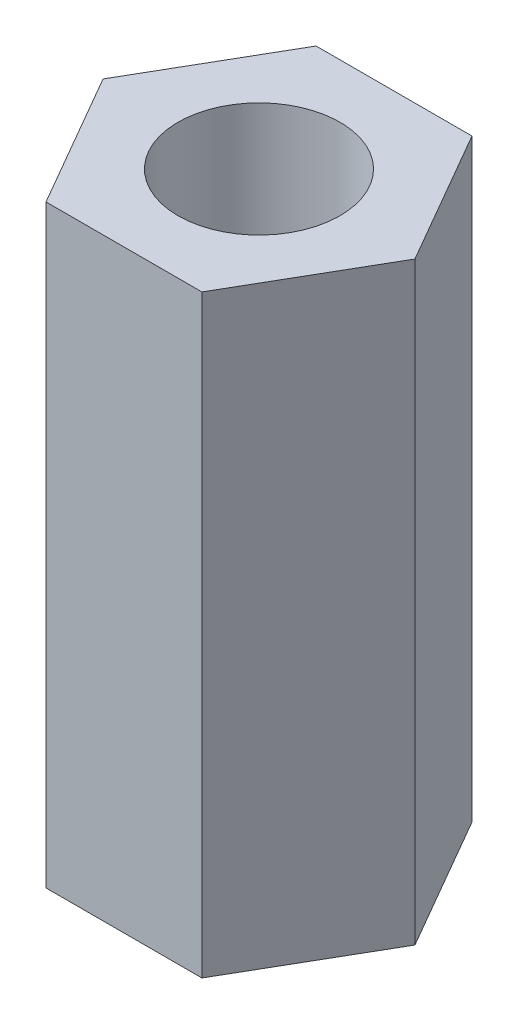
ISO-10303-21;
HEADER;
FILE_DESCRIPTION(('STEP AP214'),'2;1');
FILE_NAME('part.step','',(''),(''),'','','');
FILE_SCHEMA(('AUTOMOTIVE_DESIGN { 1 0 10303 214 1 1 1 1 }'));
ENDSEC;
DATA;
#1=APPLICATION_CONTEXT('core data for automotive mechanical design processes');
#2=APPLICATION_PROTOCOL_DEFINITION('international standard','automotive_design',2000,#1);
#3=PRODUCT_CONTEXT('',#1,'mechanical');
#4=PRODUCT('Part','Part','',(#3));
#5=PRODUCT_RELATED_PRODUCT_CATEGORY('part','',(#4));
#6=PRODUCT_DEFINITION_FORMATION('','',#4);
#7=PRODUCT_DEFINITION_CONTEXT('part definition',#1,'design');
#8=PRODUCT_DEFINITION('design','',#6,#7);
#9=PRODUCT_DEFINITION_SHAPE('','',#8);
#10=(LENGTH_UNIT() NAMED_UNIT(*) SI_UNIT(.MILLI.,.METRE.));
#11=(NAMED_UNIT(*) PLANE_ANGLE_UNIT() SI_UNIT($,.RADIAN.));
#12=(NAMED_UNIT(*) SI_UNIT($,.STERADIAN.) SOLID_ANGLE_UNIT());
#13=UNCERTAINTY_MEASURE_WITH_UNIT(LENGTH_MEASURE(1.E-05),#10,'distance_accuracy_value','');
#14=(GEOMETRIC_REPRESENTATION_CONTEXT(3) GLOBAL_UNCERTAINTY_ASSIGNED_CONTEXT((#13)) GLOBAL_UNIT_ASSIGNED_CONTEXT((#10,
#11,#12)) REPRESENTATION_CONTEXT('',''));
#15=CARTESIAN_POINT('',(0.,0.,0.));
#16=DIRECTION('',(0.,0.,1.));
#17=DIRECTION('',(1.,0.,0.));
#18=AXIS2_PLACEMENT_3D('',#15,#16,#17);
#19=CARTESIAN_POINT('',(-1.44337567297405,6.,2.5));
#20=DIRECTION('',(0.,0.,-1.));
#21=DIRECTION('',(-1.,0.,0.));
#22=AXIS2_PLACEMENT_3D('',#19,#20,#21);
#23=PLANE('',#22);
#24=DIRECTION('',(1.,0.,0.));
#25=VECTOR('',#24,1.);
#26=CARTESIAN_POINT('',(-1.44337567297405,5.,2.5));
#27=LINE('',#26,#25);
#28=CARTESIAN_POINT('',(-1.44337567297405,5.,2.5));
#29=VERTEX_POINT('',#28);
#30=CARTESIAN_POINT('',(1.44337567297408,5.,2.5));
#31=VERTEX_POINT('',#30);
#32=EDGE_CURVE('E86',#29,#31,#27,.T.);
#33=ORIENTED_EDGE('',*,*,#32,.F.);
#34=DIRECTION('',(0.,-1.,0.));
#35=VECTOR('',#34,1.);
#36=CARTESIAN_POINT('',(-1.44337567297405,6.,2.5));
#37=LINE('',#36,#35);
#38=CARTESIAN_POINT('',(-1.44337567297405,-6.,2.5));
#39=VERTEX_POINT('',#38);
#40=EDGE_CURVE('E56',#29,#39,#37,.T.);
#41=ORIENTED_EDGE('',*,*,#40,.T.);
#42=DIRECTION('',(1.,0.,0.));
#43=VECTOR('',#42,1.);
#44=CARTESIAN_POINT('',(-1.44337567297405,-6.,2.5));
#45=LINE('',#44,#43);
#46=CARTESIAN_POINT('',(1.44337567297408,-6.,2.5));
#47=VERTEX_POINT('',#46);
#48=EDGE_CURVE('E125',#39,#47,#45,.T.);
#49=ORIENTED_EDGE('',*,*,#48,.T.);
#50=DIRECTION('',(0.,-1.,0.));
#51=VECTOR('',#50,1.);
#52=CARTESIAN_POINT('',(1.44337567297408,6.,2.5));
#53=LINE('',#52,#51);
#54=EDGE_CURVE('E11',#31,#47,#53,.T.);
#55=ORIENTED_EDGE('',*,*,#54,.F.);
#56=EDGE_LOOP('',(#33,#41,#49,#55));
#57=FACE_BOUND('',#56,.T.);
#58=ADVANCED_FACE('F33',(#57),#23,.F.);
#59=CARTESIAN_POINT('',(1.44337567297408,6.,2.5));
#60=DIRECTION('',(-0.866025403784438,0.,-0.500000000000001));
#61=DIRECTION('',(-0.500000000000001,0.,0.866025403784438));
#62=AXIS2_PLACEMENT_3D('',#59,#60,#61);
#63=PLANE('',#62);
#64=DIRECTION('',(0.500000000000001,0.,-0.866025403784438));
#65=VECTOR('',#64,1.);
#66=CARTESIAN_POINT('',(1.44337567297408,5.,2.5));
#67=LINE('',#66,#65);
#68=CARTESIAN_POINT('',(2.88675134594815,5.,0.));
#69=VERTEX_POINT('',#68);
#70=EDGE_CURVE('E92',#31,#69,#67,.T.);
#71=ORIENTED_EDGE('',*,*,#70,.F.);
#72=ORIENTED_EDGE('',*,*,#54,.T.);
#73=DIRECTION('',(0.500000000000001,0.,-0.866025403784438));
#74=VECTOR('',#73,1.);
#75=CARTESIAN_POINT('',(1.44337567297408,-6.,2.5));
#76=LINE('',#75,#74);
#77=CARTESIAN_POINT('',(2.88675134594815,-6.,0.));
#78=VERTEX_POINT('',#77);
#79=EDGE_CURVE('E122',#47,#78,#76,.T.);
#80=ORIENTED_EDGE('',*,*,#79,.T.);
#81=DIRECTION('',(0.,-1.,0.));
#82=VECTOR('',#81,1.);
#83=CARTESIAN_POINT('',(2.88675134594815,6.,0.));
#84=LINE('',#83,#82);
#85=EDGE_CURVE('E41',#69,#78,#84,.T.);
#86=ORIENTED_EDGE('',*,*,#85,.F.);
#87=EDGE_LOOP('',(#71,#72,#80,#86));
#88=FACE_BOUND('',#87,.T.);
#89=ADVANCED_FACE('F123',(#88),#63,.F.);
#90=CARTESIAN_POINT('',(2.88675134594815,6.,0.));
#91=DIRECTION('',(-0.866025403784438,0.,0.500000000000001));
#92=DIRECTION('',(0.500000000000001,0.,0.866025403784438));
#93=AXIS2_PLACEMENT_3D('',#90,#91,#92);
#94=PLANE('',#93);
#95=DIRECTION('',(-0.500000000000001,0.,-0.866025403784438));
#96=VECTOR('',#95,1.);
#97=CARTESIAN_POINT('',(2.88675134594815,5.,0.));
#98=LINE('',#97,#96);
#99=CARTESIAN_POINT('',(1.44337567297408,5.,-2.50000000000001));
#100=VERTEX_POINT('',#99);
#101=EDGE_CURVE('E119',#69,#100,#98,.T.);
#102=ORIENTED_EDGE('',*,*,#101,.F.);
#103=ORIENTED_EDGE('',*,*,#85,.T.);
#104=DIRECTION('',(-0.500000000000001,0.,-0.866025403784438));
#105=VECTOR('',#104,1.);
#106=CARTESIAN_POINT('',(2.88675134594815,-6.,0.));
#107=LINE('',#106,#105);
#108=CARTESIAN_POINT('',(1.44337567297408,-6.,-2.50000000000001));
#109=VERTEX_POINT('',#108);
#110=EDGE_CURVE('E117',#78,#109,#107,.T.);
#111=ORIENTED_EDGE('',*,*,#110,.T.);
#112=DIRECTION('',(0.,-1.,0.));
#113=VECTOR('',#112,1.);
#114=CARTESIAN_POINT('',(1.44337567297408,6.,-2.50000000000001));
#115=LINE('',#114,#113);
#116=EDGE_CURVE('E107',#100,#109,#115,.T.);
#117=ORIENTED_EDGE('',*,*,#116,.F.);
#118=EDGE_LOOP('',(#102,#103,#111,#117));
#119=FACE_BOUND('',#118,.T.);
#120=ADVANCED_FACE('F114',(#119),#94,.F.);
#121=CARTESIAN_POINT('',(1.44337567297408,6.,-2.50000000000001));
#122=DIRECTION('',(0.,0.,1.));
#123=DIRECTION('',(1.,0.,0.));
#124=AXIS2_PLACEMENT_3D('',#121,#122,#123);
#125=PLANE('',#124);
#126=DIRECTION('',(-1.,0.,0.));
#127=VECTOR('',#126,1.);
#128=CARTESIAN_POINT('',(1.44337567297408,5.,-2.50000000000001));
#129=LINE('',#128,#127);
#130=CARTESIAN_POINT('',(-1.44337567297405,5.,-2.50000000000001));
#131=VERTEX_POINT('',#130);
#132=EDGE_CURVE('E144',#100,#131,#129,.T.);
#133=ORIENTED_EDGE('',*,*,#132,.F.);
#134=ORIENTED_EDGE('',*,*,#116,.T.);
#135=DIRECTION('',(-1.,0.,0.));
#136=VECTOR('',#135,1.);
#137=CARTESIAN_POINT('',(1.44337567297408,-6.,-2.50000000000001));
#138=LINE('',#137,#136);
#139=CARTESIAN_POINT('',(-1.44337567297405,-6.,-2.50000000000001));
#140=VERTEX_POINT('',#139);
#141=EDGE_CURVE('E131',#109,#140,#138,.T.);
#142=ORIENTED_EDGE('',*,*,#141,.T.);
#143=DIRECTION('',(0.,-1.,0.));
#144=VECTOR('',#143,1.);
#145=CARTESIAN_POINT('',(-1.44337567297405,6.,-2.50000000000001));
#146=LINE('',#145,#144);
#147=EDGE_CURVE('E100',#131,#140,#146,.T.);
#148=ORIENTED_EDGE('',*,*,#147,.F.);
#149=EDGE_LOOP('',(#133,#134,#142,#148));
#150=FACE_BOUND('',#149,.T.);
#151=ADVANCED_FACE('F149',(#150),#125,.F.);
#152=CARTESIAN_POINT('',(-1.44337567297405,6.,-2.50000000000001));
#153=DIRECTION('',(0.866025403784439,0.,0.5));
#154=DIRECTION('',(0.5,0.,-0.866025403784439));
#155=AXIS2_PLACEMENT_3D('',#152,#153,#154);
#156=PLANE('',#155);
#157=DIRECTION('',(-0.5,0.,0.866025403784438));
#158=VECTOR('',#157,1.);
#159=CARTESIAN_POINT('',(-1.44337567297405,5.,-2.50000000000001));
#160=LINE('',#159,#158);
#161=CARTESIAN_POINT('',(-2.88675134594812,5.,0.));
#162=VERTEX_POINT('',#161);
#163=EDGE_CURVE('E48',#131,#162,#160,.T.);
#164=ORIENTED_EDGE('',*,*,#163,.F.);
#165=ORIENTED_EDGE('',*,*,#147,.T.);
#166=DIRECTION('',(-0.5,0.,0.866025403784438));
#167=VECTOR('',#166,1.);
#168=CARTESIAN_POINT('',(-1.44337567297405,-6.,-2.50000000000001));
#169=LINE('',#168,#167);
#170=CARTESIAN_POINT('',(-2.88675134594812,-6.,0.));
#171=VERTEX_POINT('',#170);
#172=EDGE_CURVE('E102',#140,#171,#169,.T.);
#173=ORIENTED_EDGE('',*,*,#172,.T.);
#174=DIRECTION('',(0.,-1.,0.));
#175=VECTOR('',#174,1.);
#176=CARTESIAN_POINT('',(-2.88675134594812,6.,0.));
#177=LINE('',#176,#175);
#178=EDGE_CURVE('E98',#162,#171,#177,.T.);
#179=ORIENTED_EDGE('',*,*,#178,.F.);
#180=EDGE_LOOP('',(#164,#165,#173,#179));
#181=FACE_BOUND('',#180,.T.);
#182=ADVANCED_FACE('F137',(#181),#156,.F.);
#183=CARTESIAN_POINT('',(-2.88675134594812,6.,0.));
#184=DIRECTION('',(0.866025403784438,0.,-0.500000000000001));
#185=DIRECTION('',(-0.500000000000001,0.,-0.866025403784438));
#186=AXIS2_PLACEMENT_3D('',#183,#184,#185);
#187=PLANE('',#186);
#188=DIRECTION('',(0.5,0.,0.866025403784438));
#189=VECTOR('',#188,1.);
#190=CARTESIAN_POINT('',(-2.88675134594812,5.,0.));
#191=LINE('',#190,#189);
#192=EDGE_CURVE('E84',#162,#29,#191,.T.);
#193=ORIENTED_EDGE('',*,*,#192,.F.);
#194=ORIENTED_EDGE('',*,*,#178,.T.);
#195=DIRECTION('',(0.5,0.,0.866025403784438));
#196=VECTOR('',#195,1.);
#197=CARTESIAN_POINT('',(-2.88675134594812,-6.,0.));
#198=LINE('',#197,#196);
#199=EDGE_CURVE('E96',#171,#39,#198,.T.);
#200=ORIENTED_EDGE('',*,*,#199,.T.);
#201=ORIENTED_EDGE('',*,*,#40,.F.);
#202=EDGE_LOOP('',(#193,#194,#200,#201));
#203=FACE_BOUND('',#202,.T.);
#204=ADVANCED_FACE('F94',(#203),#187,.F.);
#205=CARTESIAN_POINT('',(0.,6.,0.));
#206=DIRECTION('',(0.,-1.,0.));
#207=DIRECTION('',(0.,0.,-1.));
#208=AXIS2_PLACEMENT_3D('',#205,#206,#207);
#209=CYLINDRICAL_SURFACE('',#208,1.5);
#210=CARTESIAN_POINT('',(0.,-6.,0.));
#211=DIRECTION('',(0.,1.,0.));
#212=DIRECTION('',(0.,0.,1.));
#213=AXIS2_PLACEMENT_3D('',#210,#211,#212);
#214=CIRCLE('',#213,1.5);
#215=CARTESIAN_POINT('',(0.,-6.,1.5));
#216=VERTEX_POINT('',#215);
#217=EDGE_CURVE('E139',#216,#216,#214,.T.);
#218=ORIENTED_EDGE('',*,*,#217,.F.);
#219=EDGE_LOOP('',(#218));
#220=FACE_BOUND('',#219,.T.);
#221=CARTESIAN_POINT('',(0.,5.,0.));
#222=DIRECTION('',(0.,1.,0.));
#223=DIRECTION('',(0.,0.,1.));
#224=AXIS2_PLACEMENT_3D('',#221,#222,#223);
#225=CIRCLE('',#224,1.5);
#226=CARTESIAN_POINT('',(0.,5.,1.5));
#227=VERTEX_POINT('',#226);
#228=EDGE_CURVE('E36',#227,#227,#225,.T.);
#229=ORIENTED_EDGE('',*,*,#228,.T.);
#230=EDGE_LOOP('',(#229));
#231=FACE_BOUND('',#230,.T.);
#232=ADVANCED_FACE('F190',(#220,#231),#209,.F.);
#233=CARTESIAN_POINT('',(0.,-6.,0.));
#234=DIRECTION('',(0.,1.,0.));
#235=DIRECTION('',(0.,0.,1.));
#236=AXIS2_PLACEMENT_3D('',#233,#234,#235);
#237=PLANE('',#236);
#238=ORIENTED_EDGE('',*,*,#48,.F.);
#239=ORIENTED_EDGE('',*,*,#199,.F.);
#240=ORIENTED_EDGE('',*,*,#172,.F.);
#241=ORIENTED_EDGE('',*,*,#141,.F.);
#242=ORIENTED_EDGE('',*,*,#110,.F.);
#243=ORIENTED_EDGE('',*,*,#79,.F.);
#244=EDGE_LOOP('',(#238,#239,#240,#241,#242,#243));
#245=FACE_BOUND('',#244,.T.);
#246=ORIENTED_EDGE('',*,*,#217,.T.);
#247=EDGE_LOOP('',(#246));
#248=FACE_BOUND('',#247,.T.);
#249=ADVANCED_FACE('F127',(#245,#248),#237,.F.);
#250=CARTESIAN_POINT('',(0.,5.,0.));
#251=DIRECTION('',(0.,1.,0.));
#252=DIRECTION('',(0.,0.,1.));
#253=AXIS2_PLACEMENT_3D('',#250,#251,#252);
#254=PLANE('',#253);
#255=ORIENTED_EDGE('',*,*,#228,.F.);
#256=EDGE_LOOP('',(#255));
#257=FACE_BOUND('',#256,.T.);
#258=ORIENTED_EDGE('',*,*,#192,.T.);
#259=ORIENTED_EDGE('',*,*,#32,.T.);
#260=ORIENTED_EDGE('',*,*,#70,.T.);
#261=ORIENTED_EDGE('',*,*,#101,.T.);
#262=ORIENTED_EDGE('',*,*,#132,.T.);
#263=ORIENTED_EDGE('',*,*,#163,.T.);
#264=EDGE_LOOP('',(#258,#259,#260,#261,#262,#263));
#265=FACE_BOUND('',#264,.T.);
#266=ADVANCED_FACE('F85',(#257,#265),#254,.T.);
#267=CLOSED_SHELL('',(#58,#89,#120,#151,#182,#204,#232,#249,#266));
#268=MANIFOLD_SOLID_BREP('B2',#267);
#269=ADVANCED_BREP_SHAPE_REPRESENTATION('',(#18,#268),#14);
#270=SHAPE_DEFINITION_REPRESENTATION(#9,#269);
ENDSEC;
END-ISO-10303-21;
